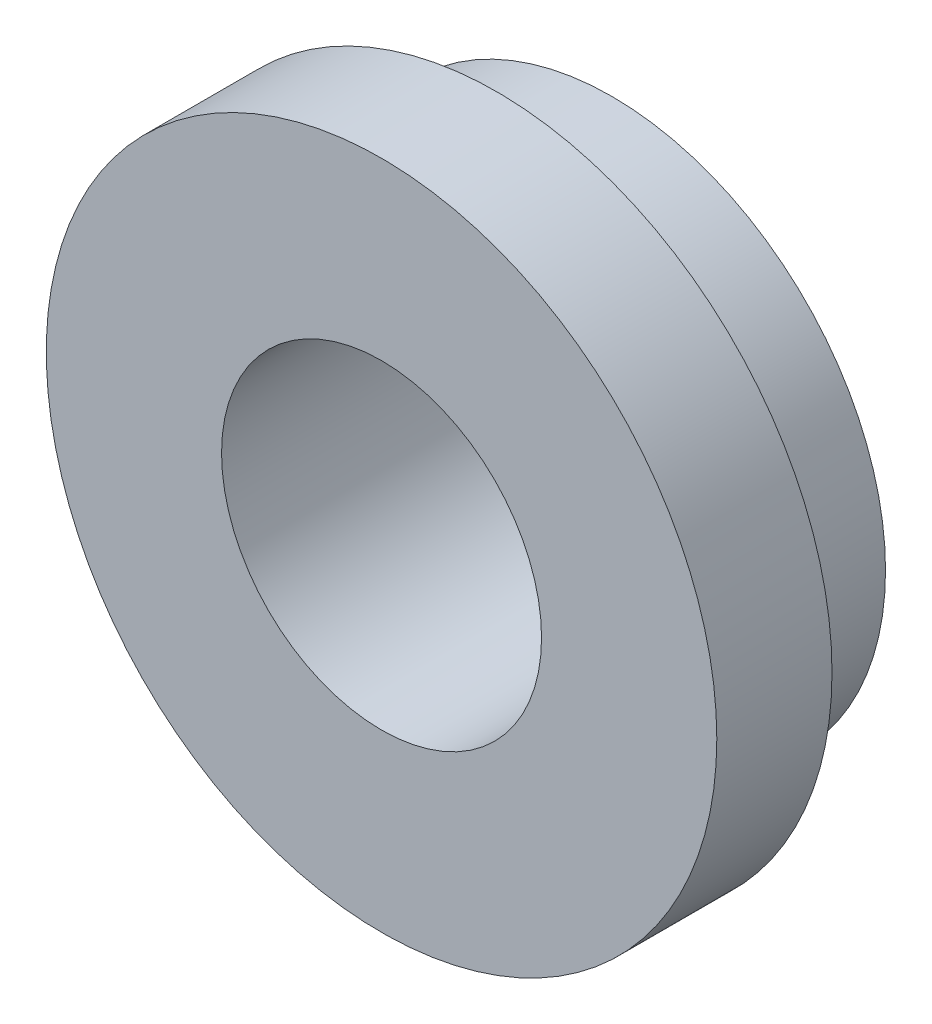
ISO-10303-21;
HEADER;
FILE_DESCRIPTION(('STEP AP214'),'2;1');
FILE_NAME('part.step','',(''),(''),'','','');
FILE_SCHEMA(('AUTOMOTIVE_DESIGN { 1 0 10303 214 1 1 1 1 }'));
ENDSEC;
DATA;
#1=APPLICATION_CONTEXT('core data for automotive mechanical design processes');
#2=APPLICATION_PROTOCOL_DEFINITION('international standard','automotive_design',2000,#1);
#3=PRODUCT_CONTEXT('',#1,'mechanical');
#4=PRODUCT('Part','Part','',(#3));
#5=PRODUCT_RELATED_PRODUCT_CATEGORY('part','',(#4));
#6=PRODUCT_DEFINITION_FORMATION('','',#4);
#7=PRODUCT_DEFINITION_CONTEXT('part definition',#1,'design');
#8=PRODUCT_DEFINITION('design','',#6,#7);
#9=PRODUCT_DEFINITION_SHAPE('','',#8);
#10=(LENGTH_UNIT() NAMED_UNIT(*) SI_UNIT(.MILLI.,.METRE.));
#11=(NAMED_UNIT(*) PLANE_ANGLE_UNIT() SI_UNIT($,.RADIAN.));
#12=(NAMED_UNIT(*) SI_UNIT($,.STERADIAN.) SOLID_ANGLE_UNIT());
#13=UNCERTAINTY_MEASURE_WITH_UNIT(LENGTH_MEASURE(1.E-05),#10,'distance_accuracy_value','');
#14=(GEOMETRIC_REPRESENTATION_CONTEXT(3) GLOBAL_UNCERTAINTY_ASSIGNED_CONTEXT((#13)) GLOBAL_UNIT_ASSIGNED_CONTEXT((#10,
#11,#12)) REPRESENTATION_CONTEXT('',''));
#15=CARTESIAN_POINT('',(0.,0.,0.));
#16=DIRECTION('',(0.,0.,1.));
#17=DIRECTION('',(1.,0.,0.));
#18=AXIS2_PLACEMENT_3D('',#15,#16,#17);
#19=CARTESIAN_POINT('',(0.,0.,6.));
#20=DIRECTION('',(0.,0.,-1.));
#21=DIRECTION('',(-1.,0.,0.));
#22=AXIS2_PLACEMENT_3D('',#19,#20,#21);
#23=CYLINDRICAL_SURFACE('',#22,14.25);
#24=CARTESIAN_POINT('',(0.,0.,6.));
#25=DIRECTION('',(0.,0.,1.));
#26=DIRECTION('',(1.,0.,0.));
#27=AXIS2_PLACEMENT_3D('',#24,#25,#26);
#28=CIRCLE('',#27,14.25);
#29=CARTESIAN_POINT('',(14.25,0.,6.));
#30=VERTEX_POINT('',#29);
#31=EDGE_CURVE('E10',#30,#30,#28,.T.);
#32=ORIENTED_EDGE('',*,*,#31,.F.);
#33=EDGE_LOOP('',(#32));
#34=FACE_BOUND('',#33,.T.);
#35=CARTESIAN_POINT('',(0.,0.,0.));
#36=DIRECTION('',(0.,0.,1.));
#37=DIRECTION('',(1.,0.,0.));
#38=AXIS2_PLACEMENT_3D('',#35,#36,#37);
#39=CIRCLE('',#38,14.25);
#40=CARTESIAN_POINT('',(14.25,0.,0.));
#41=VERTEX_POINT('',#40);
#42=EDGE_CURVE('E42',#41,#41,#39,.T.);
#43=ORIENTED_EDGE('',*,*,#42,.T.);
#44=EDGE_LOOP('',(#43));
#45=FACE_BOUND('',#44,.T.);
#46=ADVANCED_FACE('F39',(#34,#45),#23,.T.);
#47=CARTESIAN_POINT('',(0.,0.,0.));
#48=DIRECTION('',(0.,0.,1.));
#49=DIRECTION('',(1.,0.,0.));
#50=AXIS2_PLACEMENT_3D('',#47,#48,#49);
#51=PLANE('',#50);
#52=CARTESIAN_POINT('',(0.,0.,0.));
#53=DIRECTION('',(0.,0.,1.));
#54=DIRECTION('',(1.,0.,0.));
#55=AXIS2_PLACEMENT_3D('',#52,#53,#54);
#56=CIRCLE('',#55,8.33374);
#57=CARTESIAN_POINT('',(8.33374,0.,0.));
#58=VERTEX_POINT('',#57);
#59=EDGE_CURVE('E54',#58,#58,#56,.T.);
#60=ORIENTED_EDGE('',*,*,#59,.T.);
#61=EDGE_LOOP('',(#60));
#62=FACE_BOUND('',#61,.T.);
#63=ORIENTED_EDGE('',*,*,#42,.F.);
#64=EDGE_LOOP('',(#63));
#65=FACE_BOUND('',#64,.T.);
#66=ADVANCED_FACE('F75',(#62,#65),#51,.F.);
#67=CARTESIAN_POINT('',(0.,0.,12.));
#68=DIRECTION('',(0.,0.,-1.));
#69=DIRECTION('',(-1.,0.,0.));
#70=AXIS2_PLACEMENT_3D('',#67,#68,#69);
#71=CYLINDRICAL_SURFACE('',#70,17.4625);
#72=CARTESIAN_POINT('',(0.,0.,12.));
#73=DIRECTION('',(0.,0.,1.));
#74=DIRECTION('',(1.,0.,0.));
#75=AXIS2_PLACEMENT_3D('',#72,#73,#74);
#76=CIRCLE('',#75,17.4625);
#77=CARTESIAN_POINT('',(17.4625,0.,12.));
#78=VERTEX_POINT('',#77);
#79=EDGE_CURVE('E49',#78,#78,#76,.T.);
#80=ORIENTED_EDGE('',*,*,#79,.F.);
#81=EDGE_LOOP('',(#80));
#82=FACE_BOUND('',#81,.T.);
#83=CARTESIAN_POINT('',(0.,0.,6.));
#84=DIRECTION('',(0.,0.,1.));
#85=DIRECTION('',(1.,0.,0.));
#86=AXIS2_PLACEMENT_3D('',#83,#84,#85);
#87=CIRCLE('',#86,17.4625);
#88=CARTESIAN_POINT('',(17.4625,0.,6.));
#89=VERTEX_POINT('',#88);
#90=EDGE_CURVE('E51',#89,#89,#87,.T.);
#91=ORIENTED_EDGE('',*,*,#90,.T.);
#92=EDGE_LOOP('',(#91));
#93=FACE_BOUND('',#92,.T.);
#94=ADVANCED_FACE('F69',(#82,#93),#71,.T.);
#95=CARTESIAN_POINT('',(0.,0.,12.));
#96=DIRECTION('',(0.,0.,1.));
#97=DIRECTION('',(1.,0.,0.));
#98=AXIS2_PLACEMENT_3D('',#95,#96,#97);
#99=PLANE('',#98);
#100=CARTESIAN_POINT('',(0.,0.,12.));
#101=DIRECTION('',(0.,0.,1.));
#102=DIRECTION('',(1.,0.,0.));
#103=AXIS2_PLACEMENT_3D('',#100,#101,#102);
#104=CIRCLE('',#103,8.33374);
#105=CARTESIAN_POINT('',(8.33374,0.,12.));
#106=VERTEX_POINT('',#105);
#107=EDGE_CURVE('E59',#106,#106,#104,.T.);
#108=ORIENTED_EDGE('',*,*,#107,.F.);
#109=EDGE_LOOP('',(#108));
#110=FACE_BOUND('',#109,.T.);
#111=ORIENTED_EDGE('',*,*,#79,.T.);
#112=EDGE_LOOP('',(#111));
#113=FACE_BOUND('',#112,.T.);
#114=ADVANCED_FACE('F65',(#110,#113),#99,.T.);
#115=CARTESIAN_POINT('',(0.,0.,6.));
#116=DIRECTION('',(0.,0.,1.));
#117=DIRECTION('',(1.,0.,0.));
#118=AXIS2_PLACEMENT_3D('',#115,#116,#117);
#119=PLANE('',#118);
#120=ORIENTED_EDGE('',*,*,#31,.T.);
#121=EDGE_LOOP('',(#120));
#122=FACE_BOUND('',#121,.T.);
#123=ORIENTED_EDGE('',*,*,#90,.F.);
#124=EDGE_LOOP('',(#123));
#125=FACE_BOUND('',#124,.T.);
#126=ADVANCED_FACE('F68',(#122,#125),#119,.F.);
#127=CARTESIAN_POINT('',(0.,0.,12.));
#128=DIRECTION('',(0.,0.,1.));
#129=DIRECTION('',(1.,0.,0.));
#130=AXIS2_PLACEMENT_3D('',#127,#128,#129);
#131=CYLINDRICAL_SURFACE('',#130,8.33374);
#132=ORIENTED_EDGE('',*,*,#59,.F.);
#133=EDGE_LOOP('',(#132));
#134=FACE_BOUND('',#133,.T.);
#135=ORIENTED_EDGE('',*,*,#107,.T.);
#136=EDGE_LOOP('',(#135));
#137=FACE_BOUND('',#136,.T.);
#138=ADVANCED_FACE('F63',(#134,#137),#131,.F.);
#139=CLOSED_SHELL('',(#46,#66,#94,#114,#126,#138));
#140=MANIFOLD_SOLID_BREP('B2',#139);
#141=ADVANCED_BREP_SHAPE_REPRESENTATION('',(#18,#140),#14);
#142=SHAPE_DEFINITION_REPRESENTATION(#9,#141);
ENDSEC;
END-ISO-10303-21;
